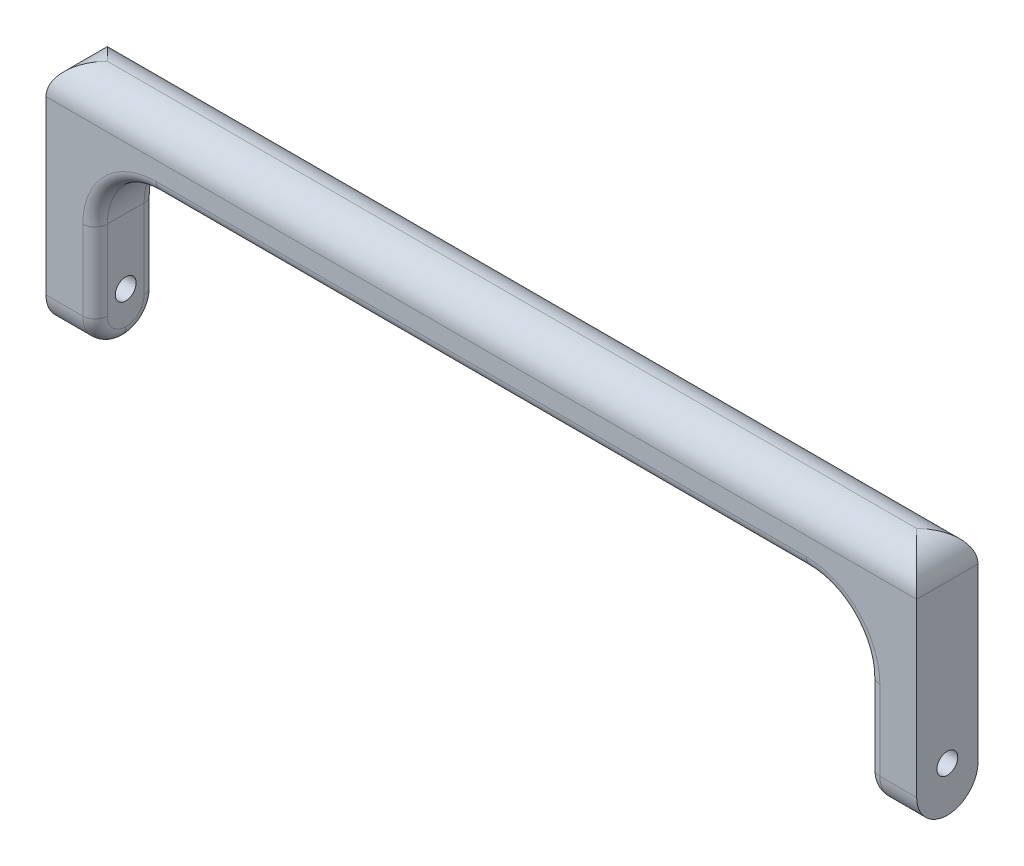
ISO-10303-21;
HEADER;
FILE_DESCRIPTION(('STEP AP214'),'2;1');
FILE_NAME('part.step','',(''),(''),'','','');
FILE_SCHEMA(('AUTOMOTIVE_DESIGN { 1 0 10303 214 1 1 1 1 }'));
ENDSEC;
DATA;
#1=APPLICATION_CONTEXT('core data for automotive mechanical design processes');
#2=APPLICATION_PROTOCOL_DEFINITION('international standard','automotive_design',2000,#1);
#3=PRODUCT_CONTEXT('',#1,'mechanical');
#4=PRODUCT('Part','Part','',(#3));
#5=PRODUCT_RELATED_PRODUCT_CATEGORY('part','',(#4));
#6=PRODUCT_DEFINITION_FORMATION('','',#4);
#7=PRODUCT_DEFINITION_CONTEXT('part definition',#1,'design');
#8=PRODUCT_DEFINITION('design','',#6,#7);
#9=PRODUCT_DEFINITION_SHAPE('','',#8);
#10=(LENGTH_UNIT() NAMED_UNIT(*) SI_UNIT(.MILLI.,.METRE.));
#11=(NAMED_UNIT(*) PLANE_ANGLE_UNIT() SI_UNIT($,.RADIAN.));
#12=(NAMED_UNIT(*) SI_UNIT($,.STERADIAN.) SOLID_ANGLE_UNIT());
#13=UNCERTAINTY_MEASURE_WITH_UNIT(LENGTH_MEASURE(1.E-05),#10,'distance_accuracy_value','');
#14=(GEOMETRIC_REPRESENTATION_CONTEXT(3) GLOBAL_UNCERTAINTY_ASSIGNED_CONTEXT((#13)) GLOBAL_UNIT_ASSIGNED_CONTEXT((#10,
#11,#12)) REPRESENTATION_CONTEXT('',''));
#15=CARTESIAN_POINT('',(0.,0.,0.));
#16=DIRECTION('',(0.,0.,1.));
#17=DIRECTION('',(1.,0.,0.));
#18=AXIS2_PLACEMENT_3D('',#15,#16,#17);
#19=CARTESIAN_POINT('',(-53.,-10.,5.));
#20=DIRECTION('',(0.,0.,-1.));
#21=DIRECTION('',(-1.,0.,0.));
#22=AXIS2_PLACEMENT_3D('',#19,#20,#21);
#23=CYLINDRICAL_SURFACE('',#22,10.);
#24=DIRECTION('',(0.,0.,-1.));
#25=VECTOR('',#24,1.);
#26=CARTESIAN_POINT('',(-63.,-10.,5.));
#27=LINE('',#26,#25);
#28=CARTESIAN_POINT('',(-63.,-10.,3.));
#29=VERTEX_POINT('',#28);
#30=CARTESIAN_POINT('',(-63.,-10.,-3.));
#31=VERTEX_POINT('',#30);
#32=EDGE_CURVE('E225',#29,#31,#27,.T.);
#33=ORIENTED_EDGE('',*,*,#32,.T.);
#34=CARTESIAN_POINT('',(-53.,-10.,-3.));
#35=DIRECTION('',(0.,0.,1.));
#36=DIRECTION('',(1.,0.,0.));
#37=AXIS2_PLACEMENT_3D('',#34,#35,#36);
#38=CIRCLE('',#37,10.);
#39=CARTESIAN_POINT('',(-53.,0.,-3.));
#40=VERTEX_POINT('',#39);
#41=EDGE_CURVE('E311',#31,#40,#38,.F.);
#42=ORIENTED_EDGE('',*,*,#41,.T.);
#43=DIRECTION('',(0.,0.,-1.));
#44=VECTOR('',#43,1.);
#45=CARTESIAN_POINT('',(-53.,0.,5.));
#46=LINE('',#45,#44);
#47=CARTESIAN_POINT('',(-53.,0.,3.));
#48=VERTEX_POINT('',#47);
#49=EDGE_CURVE('E237',#48,#40,#46,.T.);
#50=ORIENTED_EDGE('',*,*,#49,.F.);
#51=CARTESIAN_POINT('',(-53.,-10.,3.));
#52=DIRECTION('',(0.,0.,1.));
#53=DIRECTION('',(1.,0.,0.));
#54=AXIS2_PLACEMENT_3D('',#51,#52,#53);
#55=CIRCLE('',#54,10.);
#56=EDGE_CURVE('E308',#48,#29,#55,.T.);
#57=ORIENTED_EDGE('',*,*,#56,.T.);
#58=EDGE_LOOP('',(#33,#42,#50,#57));
#59=FACE_BOUND('',#58,.T.);
#60=ADVANCED_FACE('F43',(#59),#23,.F.);
#61=CARTESIAN_POINT('',(0.,0.,5.));
#62=DIRECTION('',(0.,1.,0.));
#63=DIRECTION('',(-1.,0.,0.));
#64=AXIS2_PLACEMENT_3D('',#61,#62,#63);
#65=PLANE('',#64);
#66=DIRECTION('',(0.,0.,-1.));
#67=VECTOR('',#66,1.);
#68=CARTESIAN_POINT('',(53.,0.,5.));
#69=LINE('',#68,#67);
#70=CARTESIAN_POINT('',(53.,0.,3.));
#71=VERTEX_POINT('',#70);
#72=CARTESIAN_POINT('',(53.,0.,-3.));
#73=VERTEX_POINT('',#72);
#74=EDGE_CURVE('E233',#71,#73,#69,.T.);
#75=ORIENTED_EDGE('',*,*,#74,.F.);
#76=DIRECTION('',(1.,0.,0.));
#77=VECTOR('',#76,1.);
#78=CARTESIAN_POINT('',(-53.,0.,3.));
#79=LINE('',#78,#77);
#80=EDGE_CURVE('E351',#71,#48,#79,.F.);
#81=ORIENTED_EDGE('',*,*,#80,.T.);
#82=ORIENTED_EDGE('',*,*,#49,.T.);
#83=DIRECTION('',(1.,0.,0.));
#84=VECTOR('',#83,1.);
#85=CARTESIAN_POINT('',(0.,0.,-3.));
#86=LINE('',#85,#84);
#87=EDGE_CURVE('E348',#40,#73,#86,.T.);
#88=ORIENTED_EDGE('',*,*,#87,.T.);
#89=EDGE_LOOP('',(#75,#81,#82,#88));
#90=FACE_BOUND('',#89,.T.);
#91=ADVANCED_FACE('F441',(#90),#65,.F.);
#92=CARTESIAN_POINT('',(53.,-10.,5.));
#93=DIRECTION('',(0.,0.,-1.));
#94=DIRECTION('',(-1.,0.,0.));
#95=AXIS2_PLACEMENT_3D('',#92,#93,#94);
#96=CYLINDRICAL_SURFACE('',#95,10.);
#97=DIRECTION('',(0.,0.,-1.));
#98=VECTOR('',#97,1.);
#99=CARTESIAN_POINT('',(63.,-10.,5.));
#100=LINE('',#99,#98);
#101=CARTESIAN_POINT('',(63.,-10.,3.));
#102=VERTEX_POINT('',#101);
#103=CARTESIAN_POINT('',(63.,-10.,-3.));
#104=VERTEX_POINT('',#103);
#105=EDGE_CURVE('E229',#102,#104,#100,.T.);
#106=ORIENTED_EDGE('',*,*,#105,.F.);
#107=CARTESIAN_POINT('',(53.,-10.,3.));
#108=DIRECTION('',(0.,0.,1.));
#109=DIRECTION('',(1.,0.,0.));
#110=AXIS2_PLACEMENT_3D('',#107,#108,#109);
#111=CIRCLE('',#110,10.);
#112=EDGE_CURVE('E357',#102,#71,#111,.T.);
#113=ORIENTED_EDGE('',*,*,#112,.T.);
#114=ORIENTED_EDGE('',*,*,#74,.T.);
#115=CARTESIAN_POINT('',(53.,-10.,-3.));
#116=DIRECTION('',(0.,0.,1.));
#117=DIRECTION('',(1.,0.,0.));
#118=AXIS2_PLACEMENT_3D('',#115,#116,#117);
#119=CIRCLE('',#118,10.);
#120=EDGE_CURVE('E354',#73,#104,#119,.F.);
#121=ORIENTED_EDGE('',*,*,#120,.T.);
#122=EDGE_LOOP('',(#106,#113,#114,#121));
#123=FACE_BOUND('',#122,.T.);
#124=ADVANCED_FACE('F438',(#123),#96,.F.);
#125=CARTESIAN_POINT('',(63.,0.,5.));
#126=DIRECTION('',(1.,0.,0.));
#127=DIRECTION('',(0.,0.,-1.));
#128=AXIS2_PLACEMENT_3D('',#125,#126,#127);
#129=PLANE('',#128);
#130=CARTESIAN_POINT('',(63.,-20.6526190027034,0.));
#131=DIRECTION('',(1.,0.,0.));
#132=DIRECTION('',(0.,0.,-1.));
#133=AXIS2_PLACEMENT_3D('',#130,#131,#132);
#134=CIRCLE('',#133,1.7);
#135=CARTESIAN_POINT('',(63.,-20.6526190027034,-1.7));
#136=VERTEX_POINT('',#135);
#137=EDGE_CURVE('E377',#136,#136,#134,.T.);
#138=ORIENTED_EDGE('',*,*,#137,.T.);
#139=EDGE_LOOP('',(#138));
#140=FACE_BOUND('',#139,.T.);
#141=CARTESIAN_POINT('',(63.,-23.,0.));
#142=DIRECTION('',(1.,0.,0.));
#143=DIRECTION('',(0.,0.,-1.));
#144=AXIS2_PLACEMENT_3D('',#141,#142,#143);
#145=CIRCLE('',#144,3.);
#146=CARTESIAN_POINT('',(63.,-26.,0.));
#147=VERTEX_POINT('',#146);
#148=CARTESIAN_POINT('',(63.,-23.,3.));
#149=VERTEX_POINT('',#148);
#150=EDGE_CURVE('E68',#147,#149,#145,.F.);
#151=ORIENTED_EDGE('',*,*,#150,.T.);
#152=DIRECTION('',(0.,-1.,0.));
#153=VECTOR('',#152,1.);
#154=CARTESIAN_POINT('',(63.,-10.,3.));
#155=LINE('',#154,#153);
#156=EDGE_CURVE('E368',#149,#102,#155,.F.);
#157=ORIENTED_EDGE('',*,*,#156,.T.);
#158=ORIENTED_EDGE('',*,*,#105,.T.);
#159=DIRECTION('',(0.,-1.,0.));
#160=VECTOR('',#159,1.);
#161=CARTESIAN_POINT('',(63.,0.,-3.));
#162=LINE('',#161,#160);
#163=CARTESIAN_POINT('',(63.,-23.,-3.));
#164=VERTEX_POINT('',#163);
#165=EDGE_CURVE('E360',#104,#164,#162,.T.);
#166=ORIENTED_EDGE('',*,*,#165,.T.);
#167=CARTESIAN_POINT('',(63.,-23.,0.));
#168=DIRECTION('',(1.,0.,0.));
#169=DIRECTION('',(0.,0.,-1.));
#170=AXIS2_PLACEMENT_3D('',#167,#168,#169);
#171=CIRCLE('',#170,3.);
#172=EDGE_CURVE('E363',#164,#147,#171,.F.);
#173=ORIENTED_EDGE('',*,*,#172,.T.);
#174=EDGE_LOOP('',(#151,#157,#158,#166,#173));
#175=FACE_BOUND('',#174,.T.);
#176=ADVANCED_FACE('F467',(#140,#175),#129,.F.);
#177=CARTESIAN_POINT('',(71.,0.,5.));
#178=DIRECTION('',(-1.,0.,0.));
#179=DIRECTION('',(0.,0.,1.));
#180=AXIS2_PLACEMENT_3D('',#177,#178,#179);
#181=PLANE('',#180);
#182=CARTESIAN_POINT('',(71.,-20.6526190027034,0.));
#183=DIRECTION('',(1.,0.,0.));
#184=DIRECTION('',(0.,0.,-1.));
#185=AXIS2_PLACEMENT_3D('',#182,#183,#184);
#186=CIRCLE('',#185,1.7);
#187=CARTESIAN_POINT('',(71.,-20.6526190027034,-1.7));
#188=VERTEX_POINT('',#187);
#189=EDGE_CURVE('E820',#188,#188,#186,.T.);
#190=ORIENTED_EDGE('',*,*,#189,.F.);
#191=EDGE_LOOP('',(#190));
#192=FACE_BOUND('',#191,.T.);
#193=DIRECTION('',(0.,1.,0.));
#194=VECTOR('',#193,1.);
#195=CARTESIAN_POINT('',(71.,0.,-5.));
#196=LINE('',#195,#194);
#197=CARTESIAN_POINT('',(71.,-23.,-5.));
#198=VERTEX_POINT('',#197);
#199=CARTESIAN_POINT('',(71.,5.00000000000001,-5.));
#200=VERTEX_POINT('',#199);
#201=EDGE_CURVE('E214',#198,#200,#196,.T.);
#202=ORIENTED_EDGE('',*,*,#201,.T.);
#203=DIRECTION('',(0.,0.,-1.));
#204=VECTOR('',#203,1.);
#205=CARTESIAN_POINT('',(71.,5.00000000000001,5.));
#206=LINE('',#205,#204);
#207=CARTESIAN_POINT('',(71.,5.00000000000001,5.));
#208=VERTEX_POINT('',#207);
#209=EDGE_CURVE('E271',#200,#208,#206,.F.);
#210=ORIENTED_EDGE('',*,*,#209,.T.);
#211=DIRECTION('',(0.,1.,0.));
#212=VECTOR('',#211,1.);
#213=CARTESIAN_POINT('',(71.,0.,5.));
#214=LINE('',#213,#212);
#215=CARTESIAN_POINT('',(71.,-23.,5.));
#216=VERTEX_POINT('',#215);
#217=EDGE_CURVE('E213',#216,#208,#214,.T.);
#218=ORIENTED_EDGE('',*,*,#217,.F.);
#219=CARTESIAN_POINT('',(71.,-23.,0.));
#220=DIRECTION('',(-1.,0.,0.));
#221=DIRECTION('',(0.,0.,1.));
#222=AXIS2_PLACEMENT_3D('',#219,#220,#221);
#223=CIRCLE('',#222,5.);
#224=CARTESIAN_POINT('',(71.,-28.,0.));
#225=VERTEX_POINT('',#224);
#226=EDGE_CURVE('E252',#216,#225,#223,.F.);
#227=ORIENTED_EDGE('',*,*,#226,.T.);
#228=CARTESIAN_POINT('',(71.,-23.,0.));
#229=DIRECTION('',(-1.,0.,0.));
#230=DIRECTION('',(0.,0.,1.));
#231=AXIS2_PLACEMENT_3D('',#228,#229,#230);
#232=CIRCLE('',#231,5.);
#233=EDGE_CURVE('E255',#225,#198,#232,.F.);
#234=ORIENTED_EDGE('',*,*,#233,.T.);
#235=EDGE_LOOP('',(#202,#210,#218,#227,#234));
#236=FACE_BOUND('',#235,.T.);
#237=ADVANCED_FACE('F745',(#192,#236),#181,.F.);
#238=CARTESIAN_POINT('',(-71.,0.,5.));
#239=DIRECTION('',(-1.,0.,0.));
#240=DIRECTION('',(0.,0.,1.));
#241=AXIS2_PLACEMENT_3D('',#238,#239,#240);
#242=PLANE('',#241);
#243=CARTESIAN_POINT('',(-71.,-20.6526190027034,0.));
#244=DIRECTION('',(-1.,0.,0.));
#245=DIRECTION('',(0.,0.,1.));
#246=AXIS2_PLACEMENT_3D('',#243,#244,#245);
#247=CIRCLE('',#246,1.7);
#248=CARTESIAN_POINT('',(-71.,-20.6526190027034,1.7));
#249=VERTEX_POINT('',#248);
#250=EDGE_CURVE('E816',#249,#249,#247,.T.);
#251=ORIENTED_EDGE('',*,*,#250,.F.);
#252=EDGE_LOOP('',(#251));
#253=FACE_BOUND('',#252,.T.);
#254=DIRECTION('',(0.,1.,0.));
#255=VECTOR('',#254,1.);
#256=CARTESIAN_POINT('',(-71.,0.,5.));
#257=LINE('',#256,#255);
#258=CARTESIAN_POINT('',(-71.,-23.,5.));
#259=VERTEX_POINT('',#258);
#260=CARTESIAN_POINT('',(-71.,4.99999999999999,5.));
#261=VERTEX_POINT('',#260);
#262=EDGE_CURVE('E219',#259,#261,#257,.T.);
#263=ORIENTED_EDGE('',*,*,#262,.T.);
#264=DIRECTION('',(0.,0.,-1.));
#265=VECTOR('',#264,1.);
#266=CARTESIAN_POINT('',(-71.,4.99999999999999,-5.));
#267=LINE('',#266,#265);
#268=CARTESIAN_POINT('',(-71.,4.99999999999999,-5.));
#269=VERTEX_POINT('',#268);
#270=EDGE_CURVE('E211',#261,#269,#267,.T.);
#271=ORIENTED_EDGE('',*,*,#270,.T.);
#272=DIRECTION('',(0.,1.,0.));
#273=VECTOR('',#272,1.);
#274=CARTESIAN_POINT('',(-71.,0.,-5.));
#275=LINE('',#274,#273);
#276=CARTESIAN_POINT('',(-71.,-23.,-5.));
#277=VERTEX_POINT('',#276);
#278=EDGE_CURVE('E188',#277,#269,#275,.T.);
#279=ORIENTED_EDGE('',*,*,#278,.F.);
#280=CARTESIAN_POINT('',(-71.,-23.,0.));
#281=DIRECTION('',(-1.,0.,0.));
#282=DIRECTION('',(0.,0.,1.));
#283=AXIS2_PLACEMENT_3D('',#280,#281,#282);
#284=CIRCLE('',#283,5.);
#285=CARTESIAN_POINT('',(-71.,-28.,0.));
#286=VERTEX_POINT('',#285);
#287=EDGE_CURVE('E199',#277,#286,#284,.T.);
#288=ORIENTED_EDGE('',*,*,#287,.T.);
#289=CARTESIAN_POINT('',(-71.,-23.,0.));
#290=DIRECTION('',(-1.,0.,0.));
#291=DIRECTION('',(0.,0.,1.));
#292=AXIS2_PLACEMENT_3D('',#289,#290,#291);
#293=CIRCLE('',#292,5.);
#294=EDGE_CURVE('E195',#286,#259,#293,.T.);
#295=ORIENTED_EDGE('',*,*,#294,.T.);
#296=EDGE_LOOP('',(#263,#271,#279,#288,#295));
#297=FACE_BOUND('',#296,.T.);
#298=ADVANCED_FACE('F209',(#253,#297),#242,.T.);
#299=CARTESIAN_POINT('',(-63.,0.,5.));
#300=DIRECTION('',(1.,0.,0.));
#301=DIRECTION('',(0.,0.,-1.));
#302=AXIS2_PLACEMENT_3D('',#299,#300,#301);
#303=PLANE('',#302);
#304=CARTESIAN_POINT('',(-63.,-20.6526190027034,0.));
#305=DIRECTION('',(1.,0.,0.));
#306=DIRECTION('',(0.,0.,-1.));
#307=AXIS2_PLACEMENT_3D('',#304,#305,#306);
#308=CIRCLE('',#307,1.7);
#309=CARTESIAN_POINT('',(-63.,-20.6526190027034,-1.7));
#310=VERTEX_POINT('',#309);
#311=EDGE_CURVE('E47',#310,#310,#308,.T.);
#312=ORIENTED_EDGE('',*,*,#311,.F.);
#313=EDGE_LOOP('',(#312));
#314=FACE_BOUND('',#313,.T.);
#315=CARTESIAN_POINT('',(-63.,-23.,0.));
#316=DIRECTION('',(1.,0.,0.));
#317=DIRECTION('',(0.,0.,-1.));
#318=AXIS2_PLACEMENT_3D('',#315,#316,#317);
#319=CIRCLE('',#318,3.);
#320=CARTESIAN_POINT('',(-63.,-26.,0.));
#321=VERTEX_POINT('',#320);
#322=CARTESIAN_POINT('',(-63.,-23.,-3.));
#323=VERTEX_POINT('',#322);
#324=EDGE_CURVE('E321',#321,#323,#319,.T.);
#325=ORIENTED_EDGE('',*,*,#324,.T.);
#326=DIRECTION('',(0.,-1.,0.));
#327=VECTOR('',#326,1.);
#328=CARTESIAN_POINT('',(-63.,-10.,-3.));
#329=LINE('',#328,#327);
#330=EDGE_CURVE('E324',#323,#31,#329,.F.);
#331=ORIENTED_EDGE('',*,*,#330,.T.);
#332=ORIENTED_EDGE('',*,*,#32,.F.);
#333=DIRECTION('',(0.,-1.,0.));
#334=VECTOR('',#333,1.);
#335=CARTESIAN_POINT('',(-63.,0.,3.));
#336=LINE('',#335,#334);
#337=CARTESIAN_POINT('',(-63.,-23.,3.));
#338=VERTEX_POINT('',#337);
#339=EDGE_CURVE('E315',#29,#338,#336,.T.);
#340=ORIENTED_EDGE('',*,*,#339,.T.);
#341=CARTESIAN_POINT('',(-63.,-23.,0.));
#342=DIRECTION('',(1.,0.,0.));
#343=DIRECTION('',(0.,0.,-1.));
#344=AXIS2_PLACEMENT_3D('',#341,#342,#343);
#345=CIRCLE('',#344,3.);
#346=EDGE_CURVE('E318',#338,#321,#345,.T.);
#347=ORIENTED_EDGE('',*,*,#346,.T.);
#348=EDGE_LOOP('',(#325,#331,#332,#340,#347));
#349=FACE_BOUND('',#348,.T.);
#350=ADVANCED_FACE('F717',(#314,#349),#303,.T.);
#351=CARTESIAN_POINT('',(0.,0.,5.));
#352=DIRECTION('',(0.,0.,1.));
#353=DIRECTION('',(1.,0.,0.));
#354=AXIS2_PLACEMENT_3D('',#351,#352,#353);
#355=PLANE('',#354);
#356=DIRECTION('',(-1.,0.,0.));
#357=VECTOR('',#356,1.);
#358=CARTESIAN_POINT('',(0.,-23.,5.));
#359=LINE('',#358,#357);
#360=CARTESIAN_POINT('',(-65.,-23.,5.));
#361=VERTEX_POINT('',#360);
#362=EDGE_CURVE('E248',#259,#361,#359,.F.);
#363=ORIENTED_EDGE('',*,*,#362,.T.);
#364=DIRECTION('',(0.,-1.,0.));
#365=VECTOR('',#364,1.);
#366=CARTESIAN_POINT('',(-65.,0.,5.));
#367=LINE('',#366,#365);
#368=CARTESIAN_POINT('',(-65.,-10.,5.));
#369=VERTEX_POINT('',#368);
#370=EDGE_CURVE('E345',#361,#369,#367,.F.);
#371=ORIENTED_EDGE('',*,*,#370,.T.);
#372=CARTESIAN_POINT('',(-53.,-10.,5.));
#373=DIRECTION('',(0.,0.,1.));
#374=DIRECTION('',(1.,0.,0.));
#375=AXIS2_PLACEMENT_3D('',#372,#373,#374);
#376=CIRCLE('',#375,12.);
#377=CARTESIAN_POINT('',(-53.,1.99999999999999,5.));
#378=VERTEX_POINT('',#377);
#379=EDGE_CURVE('E342',#369,#378,#376,.F.);
#380=ORIENTED_EDGE('',*,*,#379,.T.);
#381=DIRECTION('',(1.,0.,0.));
#382=VECTOR('',#381,1.);
#383=CARTESIAN_POINT('',(53.,2.00000000000001,5.));
#384=LINE('',#383,#382);
#385=CARTESIAN_POINT('',(53.,2.00000000000001,5.));
#386=VERTEX_POINT('',#385);
#387=EDGE_CURVE('E339',#378,#386,#384,.T.);
#388=ORIENTED_EDGE('',*,*,#387,.T.);
#389=CARTESIAN_POINT('',(53.,-10.,5.));
#390=DIRECTION('',(0.,0.,1.));
#391=DIRECTION('',(1.,0.,0.));
#392=AXIS2_PLACEMENT_3D('',#389,#390,#391);
#393=CIRCLE('',#392,12.);
#394=CARTESIAN_POINT('',(65.,-10.,5.));
#395=VERTEX_POINT('',#394);
#396=EDGE_CURVE('E336',#386,#395,#393,.F.);
#397=ORIENTED_EDGE('',*,*,#396,.T.);
#398=DIRECTION('',(0.,-1.,0.));
#399=VECTOR('',#398,1.);
#400=CARTESIAN_POINT('',(65.,-23.,5.));
#401=LINE('',#400,#399);
#402=CARTESIAN_POINT('',(65.,-23.,5.));
#403=VERTEX_POINT('',#402);
#404=EDGE_CURVE('E333',#395,#403,#401,.T.);
#405=ORIENTED_EDGE('',*,*,#404,.T.);
#406=DIRECTION('',(1.,0.,0.));
#407=VECTOR('',#406,1.);
#408=CARTESIAN_POINT('',(71.,-23.,5.));
#409=LINE('',#408,#407);
#410=EDGE_CURVE('E206',#403,#216,#409,.T.);
#411=ORIENTED_EDGE('',*,*,#410,.T.);
#412=ORIENTED_EDGE('',*,*,#217,.T.);
#413=DIRECTION('',(-1.,0.,0.));
#414=VECTOR('',#413,1.);
#415=CARTESIAN_POINT('',(-71.,4.99999999999999,5.));
#416=LINE('',#415,#414);
#417=EDGE_CURVE('E258',#208,#261,#416,.T.);
#418=ORIENTED_EDGE('',*,*,#417,.T.);
#419=ORIENTED_EDGE('',*,*,#262,.F.);
#420=EDGE_LOOP('',(#363,#371,#380,#388,#397,#405,#411,#412,#418,#419));
#421=FACE_BOUND('',#420,.T.);
#422=ADVANCED_FACE('F706',(#421),#355,.T.);
#423=CARTESIAN_POINT('',(0.,0.,-5.));
#424=DIRECTION('',(0.,0.,1.));
#425=DIRECTION('',(1.,0.,0.));
#426=AXIS2_PLACEMENT_3D('',#423,#424,#425);
#427=PLANE('',#426);
#428=CARTESIAN_POINT('',(-53.,-10.,-5.));
#429=DIRECTION('',(0.,0.,1.));
#430=DIRECTION('',(1.,0.,0.));
#431=AXIS2_PLACEMENT_3D('',#428,#429,#430);
#432=CIRCLE('',#431,12.);
#433=CARTESIAN_POINT('',(-53.,1.99999999999999,-5.));
#434=VERTEX_POINT('',#433);
#435=CARTESIAN_POINT('',(-65.,-10.,-5.));
#436=VERTEX_POINT('',#435);
#437=EDGE_CURVE('E303',#434,#436,#432,.T.);
#438=ORIENTED_EDGE('',*,*,#437,.T.);
#439=DIRECTION('',(0.,-1.,0.));
#440=VECTOR('',#439,1.);
#441=CARTESIAN_POINT('',(-65.,-23.,-5.));
#442=LINE('',#441,#440);
#443=CARTESIAN_POINT('',(-65.,-23.,-5.));
#444=VERTEX_POINT('',#443);
#445=EDGE_CURVE('E191',#436,#444,#442,.T.);
#446=ORIENTED_EDGE('',*,*,#445,.T.);
#447=DIRECTION('',(-1.,0.,0.));
#448=VECTOR('',#447,1.);
#449=CARTESIAN_POINT('',(-71.,-23.,-5.));
#450=LINE('',#449,#448);
#451=EDGE_CURVE('E183',#444,#277,#450,.T.);
#452=ORIENTED_EDGE('',*,*,#451,.T.);
#453=ORIENTED_EDGE('',*,*,#278,.T.);
#454=DIRECTION('',(-1.,0.,0.));
#455=VECTOR('',#454,1.);
#456=CARTESIAN_POINT('',(0.,5.,-5.));
#457=LINE('',#456,#455);
#458=EDGE_CURVE('E268',#269,#200,#457,.F.);
#459=ORIENTED_EDGE('',*,*,#458,.T.);
#460=ORIENTED_EDGE('',*,*,#201,.F.);
#461=DIRECTION('',(1.,0.,0.));
#462=VECTOR('',#461,1.);
#463=CARTESIAN_POINT('',(0.,-23.,-5.));
#464=LINE('',#463,#462);
#465=CARTESIAN_POINT('',(65.,-23.,-5.));
#466=VERTEX_POINT('',#465);
#467=EDGE_CURVE('E196',#198,#466,#464,.F.);
#468=ORIENTED_EDGE('',*,*,#467,.T.);
#469=DIRECTION('',(0.,-1.,0.));
#470=VECTOR('',#469,1.);
#471=CARTESIAN_POINT('',(65.,0.,-5.));
#472=LINE('',#471,#470);
#473=CARTESIAN_POINT('',(65.,-10.,-5.));
#474=VERTEX_POINT('',#473);
#475=EDGE_CURVE('E300',#466,#474,#472,.F.);
#476=ORIENTED_EDGE('',*,*,#475,.T.);
#477=CARTESIAN_POINT('',(53.,-10.,-5.));
#478=DIRECTION('',(0.,0.,1.));
#479=DIRECTION('',(1.,0.,0.));
#480=AXIS2_PLACEMENT_3D('',#477,#478,#479);
#481=CIRCLE('',#480,12.);
#482=CARTESIAN_POINT('',(53.,2.00000000000001,-5.));
#483=VERTEX_POINT('',#482);
#484=EDGE_CURVE('E297',#474,#483,#481,.T.);
#485=ORIENTED_EDGE('',*,*,#484,.T.);
#486=DIRECTION('',(1.,0.,0.));
#487=VECTOR('',#486,1.);
#488=CARTESIAN_POINT('',(0.,2.,-5.));
#489=LINE('',#488,#487);
#490=EDGE_CURVE('E276',#483,#434,#489,.F.);
#491=ORIENTED_EDGE('',*,*,#490,.T.);
#492=EDGE_LOOP('',(#438,#446,#452,#453,#459,#460,#468,#476,#485,#491));
#493=FACE_BOUND('',#492,.T.);
#494=ADVANCED_FACE('F186',(#493),#427,.F.);
#495=CARTESIAN_POINT('',(0.,-23.,0.));
#496=DIRECTION('',(-1.,0.,0.));
#497=DIRECTION('',(0.,-1.,0.));
#498=AXIS2_PLACEMENT_3D('',#495,#496,#497);
#499=CYLINDRICAL_SURFACE('',#498,5.);
#500=DIRECTION('',(-1.,0.,0.));
#501=VECTOR('',#500,1.);
#502=CARTESIAN_POINT('',(0.,-28.,0.));
#503=LINE('',#502,#501);
#504=CARTESIAN_POINT('',(-65.,-28.,0.));
#505=VERTEX_POINT('',#504);
#506=EDGE_CURVE('E202',#505,#286,#503,.T.);
#507=ORIENTED_EDGE('',*,*,#506,.F.);
#508=CARTESIAN_POINT('',(-65.,-23.,0.));
#509=DIRECTION('',(1.,0.,0.));
#510=DIRECTION('',(0.,0.,-1.));
#511=AXIS2_PLACEMENT_3D('',#508,#509,#510);
#512=CIRCLE('',#511,5.);
#513=EDGE_CURVE('E330',#505,#361,#512,.F.);
#514=ORIENTED_EDGE('',*,*,#513,.T.);
#515=ORIENTED_EDGE('',*,*,#362,.F.);
#516=ORIENTED_EDGE('',*,*,#294,.F.);
#517=EDGE_LOOP('',(#507,#514,#515,#516));
#518=FACE_BOUND('',#517,.T.);
#519=ADVANCED_FACE('F501',(#518),#499,.T.);
#520=CARTESIAN_POINT('',(0.,-23.,0.));
#521=DIRECTION('',(1.,0.,0.));
#522=DIRECTION('',(0.,1.,0.));
#523=AXIS2_PLACEMENT_3D('',#520,#521,#522);
#524=CYLINDRICAL_SURFACE('',#523,5.);
#525=ORIENTED_EDGE('',*,*,#451,.F.);
#526=CARTESIAN_POINT('',(-65.,-23.,0.));
#527=DIRECTION('',(1.,0.,0.));
#528=DIRECTION('',(0.,0.,-1.));
#529=AXIS2_PLACEMENT_3D('',#526,#527,#528);
#530=CIRCLE('',#529,5.);
#531=EDGE_CURVE('E327',#444,#505,#530,.F.);
#532=ORIENTED_EDGE('',*,*,#531,.T.);
#533=ORIENTED_EDGE('',*,*,#506,.T.);
#534=ORIENTED_EDGE('',*,*,#287,.F.);
#535=EDGE_LOOP('',(#525,#532,#533,#534));
#536=FACE_BOUND('',#535,.T.);
#537=ADVANCED_FACE('F200',(#536),#524,.T.);
#538=CARTESIAN_POINT('',(0.,-23.,0.));
#539=DIRECTION('',(-1.,0.,0.));
#540=DIRECTION('',(0.,0.,1.));
#541=AXIS2_PLACEMENT_3D('',#538,#539,#540);
#542=CYLINDRICAL_SURFACE('',#541,5.);
#543=ORIENTED_EDGE('',*,*,#410,.F.);
#544=CARTESIAN_POINT('',(65.,-23.,0.));
#545=DIRECTION('',(1.,0.,0.));
#546=DIRECTION('',(0.,0.,-1.));
#547=AXIS2_PLACEMENT_3D('',#544,#545,#546);
#548=CIRCLE('',#547,5.);
#549=CARTESIAN_POINT('',(65.,-28.,0.));
#550=VERTEX_POINT('',#549);
#551=EDGE_CURVE('E53',#403,#550,#548,.T.);
#552=ORIENTED_EDGE('',*,*,#551,.T.);
#553=DIRECTION('',(1.,0.,0.));
#554=VECTOR('',#553,1.);
#555=CARTESIAN_POINT('',(63.,-28.,0.));
#556=LINE('',#555,#554);
#557=EDGE_CURVE('E261',#225,#550,#556,.F.);
#558=ORIENTED_EDGE('',*,*,#557,.F.);
#559=ORIENTED_EDGE('',*,*,#226,.F.);
#560=EDGE_LOOP('',(#543,#552,#558,#559));
#561=FACE_BOUND('',#560,.T.);
#562=ADVANCED_FACE('F500',(#561),#542,.T.);
#563=CARTESIAN_POINT('',(0.,-23.,0.));
#564=DIRECTION('',(1.,0.,0.));
#565=DIRECTION('',(0.,0.,-1.));
#566=AXIS2_PLACEMENT_3D('',#563,#564,#565);
#567=CYLINDRICAL_SURFACE('',#566,5.);
#568=ORIENTED_EDGE('',*,*,#557,.T.);
#569=CARTESIAN_POINT('',(65.,-23.,0.));
#570=DIRECTION('',(1.,0.,0.));
#571=DIRECTION('',(0.,0.,-1.));
#572=AXIS2_PLACEMENT_3D('',#569,#570,#571);
#573=CIRCLE('',#572,5.);
#574=EDGE_CURVE('E11',#550,#466,#573,.T.);
#575=ORIENTED_EDGE('',*,*,#574,.T.);
#576=ORIENTED_EDGE('',*,*,#467,.F.);
#577=ORIENTED_EDGE('',*,*,#233,.F.);
#578=EDGE_LOOP('',(#568,#575,#576,#577));
#579=FACE_BOUND('',#578,.T.);
#580=ADVANCED_FACE('F505',(#579),#567,.T.);
#581=CARTESIAN_POINT('',(0.,5.,0.));
#582=DIRECTION('',(-1.,0.,0.));
#583=DIRECTION('',(0.,-1.,0.));
#584=AXIS2_PLACEMENT_3D('',#581,#582,#583);
#585=CYLINDRICAL_SURFACE('',#584,5.);
#586=CARTESIAN_POINT('',(66.,5.00000000000001,0.));
#587=DIRECTION('',(-0.707106781186547,0.,-0.707106781186547));
#588=DIRECTION('',(0.707106781186547,0.,-0.707106781186547));
#589=AXIS2_PLACEMENT_3D('',#586,#587,#588);
#590=ELLIPSE('',#589,7.07106781186547,5.);
#591=CARTESIAN_POINT('',(66.,10.,0.));
#592=VERTEX_POINT('',#591);
#593=EDGE_CURVE('E264',#200,#592,#590,.F.);
#594=ORIENTED_EDGE('',*,*,#593,.F.);
#595=ORIENTED_EDGE('',*,*,#458,.F.);
#596=CARTESIAN_POINT('',(-66.,4.99999999999999,0.));
#597=DIRECTION('',(-0.707106781186547,0.,0.707106781186547));
#598=DIRECTION('',(0.707106781186547,0.,0.707106781186547));
#599=AXIS2_PLACEMENT_3D('',#596,#597,#598);
#600=ELLIPSE('',#599,7.07106781186547,5.);
#601=CARTESIAN_POINT('',(-66.,9.99999999999999,0.));
#602=VERTEX_POINT('',#601);
#603=EDGE_CURVE('E289',#602,#269,#600,.T.);
#604=ORIENTED_EDGE('',*,*,#603,.F.);
#605=DIRECTION('',(-1.,0.,0.));
#606=VECTOR('',#605,1.);
#607=CARTESIAN_POINT('',(0.,10.,0.));
#608=LINE('',#607,#606);
#609=EDGE_CURVE('E285',#592,#602,#608,.T.);
#610=ORIENTED_EDGE('',*,*,#609,.F.);
#611=EDGE_LOOP('',(#594,#595,#604,#610));
#612=FACE_BOUND('',#611,.T.);
#613=ADVANCED_FACE('F508',(#612),#585,.T.);
#614=CARTESIAN_POINT('',(66.,5.00000000000001,5.));
#615=DIRECTION('',(0.,0.,-1.));
#616=DIRECTION('',(-1.,0.,0.));
#617=AXIS2_PLACEMENT_3D('',#614,#615,#616);
#618=CYLINDRICAL_SURFACE('',#617,5.);
#619=ORIENTED_EDGE('',*,*,#209,.F.);
#620=ORIENTED_EDGE('',*,*,#593,.T.);
#621=CARTESIAN_POINT('',(66.,5.00000000000001,0.));
#622=DIRECTION('',(0.707106781186547,0.,-0.707106781186547));
#623=DIRECTION('',(-0.707106781186547,0.,-0.707106781186547));
#624=AXIS2_PLACEMENT_3D('',#621,#622,#623);
#625=ELLIPSE('',#624,7.07106781186547,5.);
#626=EDGE_CURVE('E280',#208,#592,#625,.F.);
#627=ORIENTED_EDGE('',*,*,#626,.F.);
#628=EDGE_LOOP('',(#619,#620,#627));
#629=FACE_BOUND('',#628,.T.);
#630=ADVANCED_FACE('F519',(#629),#618,.T.);
#631=CARTESIAN_POINT('',(-66.,4.99999999999999,5.));
#632=DIRECTION('',(0.,0.,1.));
#633=DIRECTION('',(1.,0.,0.));
#634=AXIS2_PLACEMENT_3D('',#631,#632,#633);
#635=CYLINDRICAL_SURFACE('',#634,5.);
#636=ORIENTED_EDGE('',*,*,#603,.T.);
#637=ORIENTED_EDGE('',*,*,#270,.F.);
#638=CARTESIAN_POINT('',(-66.,4.99999999999999,0.));
#639=DIRECTION('',(0.707106781186547,0.,0.707106781186547));
#640=DIRECTION('',(-0.707106781186547,0.,0.707106781186547));
#641=AXIS2_PLACEMENT_3D('',#638,#639,#640);
#642=ELLIPSE('',#641,7.07106781186547,5.);
#643=EDGE_CURVE('E277',#602,#261,#642,.T.);
#644=ORIENTED_EDGE('',*,*,#643,.F.);
#645=EDGE_LOOP('',(#636,#637,#644));
#646=FACE_BOUND('',#645,.T.);
#647=ADVANCED_FACE('F515',(#646),#635,.T.);
#648=CARTESIAN_POINT('',(0.,5.,0.));
#649=DIRECTION('',(1.,0.,0.));
#650=DIRECTION('',(0.,1.,0.));
#651=AXIS2_PLACEMENT_3D('',#648,#649,#650);
#652=CYLINDRICAL_SURFACE('',#651,5.);
#653=ORIENTED_EDGE('',*,*,#626,.T.);
#654=ORIENTED_EDGE('',*,*,#609,.T.);
#655=ORIENTED_EDGE('',*,*,#643,.T.);
#656=ORIENTED_EDGE('',*,*,#417,.F.);
#657=EDGE_LOOP('',(#653,#654,#655,#656));
#658=FACE_BOUND('',#657,.T.);
#659=ADVANCED_FACE('F512',(#658),#652,.T.);
#660=CARTESIAN_POINT('',(53.,-10.,3.));
#661=DIRECTION('',(0.,0.,1.));
#662=DIRECTION('',(1.,0.,0.));
#663=AXIS2_PLACEMENT_3D('',#660,#661,#662);
#664=TOROIDAL_SURFACE('',#663,12.,2.);
#665=CARTESIAN_POINT('',(53.,2.00000000000001,3.));
#666=DIRECTION('',(-1.,0.,0.));
#667=DIRECTION('',(0.,0.,1.));
#668=AXIS2_PLACEMENT_3D('',#665,#666,#667);
#669=CIRCLE('',#668,2.);
#670=EDGE_CURVE('E420',#71,#386,#669,.T.);
#671=ORIENTED_EDGE('',*,*,#670,.F.);
#672=ORIENTED_EDGE('',*,*,#112,.F.);
#673=CARTESIAN_POINT('',(65.,-10.,3.));
#674=DIRECTION('',(0.,-1.,0.));
#675=DIRECTION('',(0.,0.,-1.));
#676=AXIS2_PLACEMENT_3D('',#673,#674,#675);
#677=CIRCLE('',#676,2.);
#678=EDGE_CURVE('E281',#395,#102,#677,.T.);
#679=ORIENTED_EDGE('',*,*,#678,.F.);
#680=ORIENTED_EDGE('',*,*,#396,.F.);
#681=EDGE_LOOP('',(#671,#672,#679,#680));
#682=FACE_BOUND('',#681,.T.);
#683=ADVANCED_FACE('F45',(#682),#664,.T.);
#684=CARTESIAN_POINT('',(65.,0.,3.));
#685=DIRECTION('',(0.,1.,0.));
#686=DIRECTION('',(0.,0.,1.));
#687=AXIS2_PLACEMENT_3D('',#684,#685,#686);
#688=CYLINDRICAL_SURFACE('',#687,2.);
#689=ORIENTED_EDGE('',*,*,#678,.T.);
#690=ORIENTED_EDGE('',*,*,#156,.F.);
#691=CARTESIAN_POINT('',(65.,-23.,3.));
#692=DIRECTION('',(0.,-1.,0.));
#693=DIRECTION('',(0.,0.,-1.));
#694=AXIS2_PLACEMENT_3D('',#691,#692,#693);
#695=CIRCLE('',#694,2.);
#696=EDGE_CURVE('E416',#403,#149,#695,.T.);
#697=ORIENTED_EDGE('',*,*,#696,.F.);
#698=ORIENTED_EDGE('',*,*,#404,.F.);
#699=EDGE_LOOP('',(#689,#690,#697,#698));
#700=FACE_BOUND('',#699,.T.);
#701=ADVANCED_FACE('F428',(#700),#688,.T.);
#702=CARTESIAN_POINT('',(0.,2.,3.));
#703=DIRECTION('',(-1.,0.,0.));
#704=DIRECTION('',(0.,-1.,0.));
#705=AXIS2_PLACEMENT_3D('',#702,#703,#704);
#706=CYLINDRICAL_SURFACE('',#705,2.);
#707=ORIENTED_EDGE('',*,*,#670,.T.);
#708=ORIENTED_EDGE('',*,*,#387,.F.);
#709=CARTESIAN_POINT('',(-53.,1.99999999999999,3.));
#710=DIRECTION('',(-1.,0.,0.));
#711=DIRECTION('',(0.,0.,1.));
#712=AXIS2_PLACEMENT_3D('',#709,#710,#711);
#713=CIRCLE('',#712,2.);
#714=EDGE_CURVE('E412',#48,#378,#713,.T.);
#715=ORIENTED_EDGE('',*,*,#714,.F.);
#716=ORIENTED_EDGE('',*,*,#80,.F.);
#717=EDGE_LOOP('',(#707,#708,#715,#716));
#718=FACE_BOUND('',#717,.T.);
#719=ADVANCED_FACE('F480',(#718),#706,.T.);
#720=CARTESIAN_POINT('',(65.,-23.,0.));
#721=DIRECTION('',(1.,0.,0.));
#722=DIRECTION('',(0.,0.,-1.));
#723=AXIS2_PLACEMENT_3D('',#720,#721,#722);
#724=TOROIDAL_SURFACE('',#723,3.,2.);
#725=ORIENTED_EDGE('',*,*,#696,.T.);
#726=ORIENTED_EDGE('',*,*,#150,.F.);
#727=CARTESIAN_POINT('',(65.,-26.,0.));
#728=DIRECTION('',(0.,0.,-1.));
#729=DIRECTION('',(-1.,0.,0.));
#730=AXIS2_PLACEMENT_3D('',#727,#728,#729);
#731=CIRCLE('',#730,2.);
#732=EDGE_CURVE('E408',#550,#147,#731,.T.);
#733=ORIENTED_EDGE('',*,*,#732,.F.);
#734=ORIENTED_EDGE('',*,*,#551,.F.);
#735=EDGE_LOOP('',(#725,#726,#733,#734));
#736=FACE_BOUND('',#735,.T.);
#737=ADVANCED_FACE('F477',(#736),#724,.T.);
#738=CARTESIAN_POINT('',(-53.,-10.,3.));
#739=DIRECTION('',(0.,0.,1.));
#740=DIRECTION('',(1.,0.,0.));
#741=AXIS2_PLACEMENT_3D('',#738,#739,#740);
#742=TOROIDAL_SURFACE('',#741,12.,2.);
#743=ORIENTED_EDGE('',*,*,#714,.T.);
#744=ORIENTED_EDGE('',*,*,#379,.F.);
#745=CARTESIAN_POINT('',(-65.,-10.,3.));
#746=DIRECTION('',(0.,-1.,0.));
#747=DIRECTION('',(0.,0.,-1.));
#748=AXIS2_PLACEMENT_3D('',#745,#746,#747);
#749=CIRCLE('',#748,2.);
#750=EDGE_CURVE('E404',#29,#369,#749,.T.);
#751=ORIENTED_EDGE('',*,*,#750,.F.);
#752=ORIENTED_EDGE('',*,*,#56,.F.);
#753=EDGE_LOOP('',(#743,#744,#751,#752));
#754=FACE_BOUND('',#753,.T.);
#755=ADVANCED_FACE('F479',(#754),#742,.T.);
#756=CARTESIAN_POINT('',(65.,-23.,0.));
#757=DIRECTION('',(1.,0.,0.));
#758=DIRECTION('',(0.,0.,-1.));
#759=AXIS2_PLACEMENT_3D('',#756,#757,#758);
#760=TOROIDAL_SURFACE('',#759,3.,2.);
#761=ORIENTED_EDGE('',*,*,#732,.T.);
#762=ORIENTED_EDGE('',*,*,#172,.F.);
#763=CARTESIAN_POINT('',(65.,-23.,-3.));
#764=DIRECTION('',(0.,1.,0.));
#765=DIRECTION('',(0.,0.,1.));
#766=AXIS2_PLACEMENT_3D('',#763,#764,#765);
#767=CIRCLE('',#766,2.);
#768=EDGE_CURVE('E400',#466,#164,#767,.T.);
#769=ORIENTED_EDGE('',*,*,#768,.F.);
#770=ORIENTED_EDGE('',*,*,#574,.F.);
#771=EDGE_LOOP('',(#761,#762,#769,#770));
#772=FACE_BOUND('',#771,.T.);
#773=ADVANCED_FACE('F474',(#772),#760,.T.);
#774=CARTESIAN_POINT('',(-65.,0.,3.));
#775=DIRECTION('',(0.,-1.,0.));
#776=DIRECTION('',(0.,0.,-1.));
#777=AXIS2_PLACEMENT_3D('',#774,#775,#776);
#778=CYLINDRICAL_SURFACE('',#777,2.);
#779=ORIENTED_EDGE('',*,*,#750,.T.);
#780=ORIENTED_EDGE('',*,*,#370,.F.);
#781=CARTESIAN_POINT('',(-65.,-23.,3.));
#782=DIRECTION('',(0.,-1.,0.));
#783=DIRECTION('',(0.,0.,-1.));
#784=AXIS2_PLACEMENT_3D('',#781,#782,#783);
#785=CIRCLE('',#784,2.);
#786=EDGE_CURVE('E396',#338,#361,#785,.T.);
#787=ORIENTED_EDGE('',*,*,#786,.F.);
#788=ORIENTED_EDGE('',*,*,#339,.F.);
#789=EDGE_LOOP('',(#779,#780,#787,#788));
#790=FACE_BOUND('',#789,.T.);
#791=ADVANCED_FACE('F546',(#790),#778,.T.);
#792=CARTESIAN_POINT('',(65.,0.,-3.));
#793=DIRECTION('',(0.,-1.,0.));
#794=DIRECTION('',(0.,0.,-1.));
#795=AXIS2_PLACEMENT_3D('',#792,#793,#794);
#796=CYLINDRICAL_SURFACE('',#795,2.);
#797=ORIENTED_EDGE('',*,*,#768,.T.);
#798=ORIENTED_EDGE('',*,*,#165,.F.);
#799=CARTESIAN_POINT('',(65.,-10.,-3.));
#800=DIRECTION('',(0.,1.,0.));
#801=DIRECTION('',(0.,0.,1.));
#802=AXIS2_PLACEMENT_3D('',#799,#800,#801);
#803=CIRCLE('',#802,2.);
#804=EDGE_CURVE('E392',#474,#104,#803,.T.);
#805=ORIENTED_EDGE('',*,*,#804,.F.);
#806=ORIENTED_EDGE('',*,*,#475,.F.);
#807=EDGE_LOOP('',(#797,#798,#805,#806));
#808=FACE_BOUND('',#807,.T.);
#809=ADVANCED_FACE('F470',(#808),#796,.T.);
#810=CARTESIAN_POINT('',(-65.,-23.,0.));
#811=DIRECTION('',(1.,0.,0.));
#812=DIRECTION('',(0.,0.,-1.));
#813=AXIS2_PLACEMENT_3D('',#810,#811,#812);
#814=TOROIDAL_SURFACE('',#813,3.,2.);
#815=ORIENTED_EDGE('',*,*,#786,.T.);
#816=ORIENTED_EDGE('',*,*,#513,.F.);
#817=CARTESIAN_POINT('',(-65.,-26.,0.));
#818=DIRECTION('',(0.,0.,-1.));
#819=DIRECTION('',(-1.,0.,0.));
#820=AXIS2_PLACEMENT_3D('',#817,#818,#819);
#821=CIRCLE('',#820,2.);
#822=EDGE_CURVE('E388',#321,#505,#821,.T.);
#823=ORIENTED_EDGE('',*,*,#822,.F.);
#824=ORIENTED_EDGE('',*,*,#346,.F.);
#825=EDGE_LOOP('',(#815,#816,#823,#824));
#826=FACE_BOUND('',#825,.T.);
#827=ADVANCED_FACE('F540',(#826),#814,.T.);
#828=CARTESIAN_POINT('',(53.,-10.,-3.));
#829=DIRECTION('',(0.,0.,1.));
#830=DIRECTION('',(1.,0.,0.));
#831=AXIS2_PLACEMENT_3D('',#828,#829,#830);
#832=TOROIDAL_SURFACE('',#831,12.,2.);
#833=ORIENTED_EDGE('',*,*,#804,.T.);
#834=ORIENTED_EDGE('',*,*,#120,.F.);
#835=CARTESIAN_POINT('',(53.,2.00000000000001,-3.));
#836=DIRECTION('',(-1.,0.,0.));
#837=DIRECTION('',(0.,0.,1.));
#838=AXIS2_PLACEMENT_3D('',#835,#836,#837);
#839=CIRCLE('',#838,2.);
#840=EDGE_CURVE('E384',#483,#73,#839,.T.);
#841=ORIENTED_EDGE('',*,*,#840,.F.);
#842=ORIENTED_EDGE('',*,*,#484,.F.);
#843=EDGE_LOOP('',(#833,#834,#841,#842));
#844=FACE_BOUND('',#843,.T.);
#845=ADVANCED_FACE('F465',(#844),#832,.T.);
#846=CARTESIAN_POINT('',(-65.,-23.,0.));
#847=DIRECTION('',(1.,0.,0.));
#848=DIRECTION('',(0.,0.,-1.));
#849=AXIS2_PLACEMENT_3D('',#846,#847,#848);
#850=TOROIDAL_SURFACE('',#849,3.,2.);
#851=ORIENTED_EDGE('',*,*,#822,.T.);
#852=ORIENTED_EDGE('',*,*,#531,.F.);
#853=CARTESIAN_POINT('',(-65.,-23.,-3.));
#854=DIRECTION('',(0.,1.,0.));
#855=DIRECTION('',(0.,0.,1.));
#856=AXIS2_PLACEMENT_3D('',#853,#854,#855);
#857=CIRCLE('',#856,2.);
#858=EDGE_CURVE('E380',#323,#444,#857,.T.);
#859=ORIENTED_EDGE('',*,*,#858,.F.);
#860=ORIENTED_EDGE('',*,*,#324,.F.);
#861=EDGE_LOOP('',(#851,#852,#859,#860));
#862=FACE_BOUND('',#861,.T.);
#863=ADVANCED_FACE('F534',(#862),#850,.T.);
#864=CARTESIAN_POINT('',(0.,2.,-3.));
#865=DIRECTION('',(1.,0.,0.));
#866=DIRECTION('',(0.,1.,0.));
#867=AXIS2_PLACEMENT_3D('',#864,#865,#866);
#868=CYLINDRICAL_SURFACE('',#867,2.);
#869=ORIENTED_EDGE('',*,*,#840,.T.);
#870=ORIENTED_EDGE('',*,*,#87,.F.);
#871=CARTESIAN_POINT('',(-53.,1.99999999999999,-3.));
#872=DIRECTION('',(-1.,0.,0.));
#873=DIRECTION('',(0.,0.,1.));
#874=AXIS2_PLACEMENT_3D('',#871,#872,#873);
#875=CIRCLE('',#874,2.);
#876=EDGE_CURVE('E376',#434,#40,#875,.T.);
#877=ORIENTED_EDGE('',*,*,#876,.F.);
#878=ORIENTED_EDGE('',*,*,#490,.F.);
#879=EDGE_LOOP('',(#869,#870,#877,#878));
#880=FACE_BOUND('',#879,.T.);
#881=ADVANCED_FACE('F446',(#880),#868,.T.);
#882=CARTESIAN_POINT('',(-65.,0.,-3.));
#883=DIRECTION('',(0.,1.,0.));
#884=DIRECTION('',(0.,0.,1.));
#885=AXIS2_PLACEMENT_3D('',#882,#883,#884);
#886=CYLINDRICAL_SURFACE('',#885,2.);
#887=ORIENTED_EDGE('',*,*,#858,.T.);
#888=ORIENTED_EDGE('',*,*,#445,.F.);
#889=CARTESIAN_POINT('',(-65.,-10.,-3.));
#890=DIRECTION('',(0.,1.,0.));
#891=DIRECTION('',(0.,0.,1.));
#892=AXIS2_PLACEMENT_3D('',#889,#890,#891);
#893=CIRCLE('',#892,2.);
#894=EDGE_CURVE('E373',#31,#436,#893,.T.);
#895=ORIENTED_EDGE('',*,*,#894,.F.);
#896=ORIENTED_EDGE('',*,*,#330,.F.);
#897=EDGE_LOOP('',(#887,#888,#895,#896));
#898=FACE_BOUND('',#897,.T.);
#899=ADVANCED_FACE('F459',(#898),#886,.T.);
#900=CARTESIAN_POINT('',(-53.,-10.,-3.));
#901=DIRECTION('',(0.,0.,1.));
#902=DIRECTION('',(1.,0.,0.));
#903=AXIS2_PLACEMENT_3D('',#900,#901,#902);
#904=TOROIDAL_SURFACE('',#903,12.,2.);
#905=ORIENTED_EDGE('',*,*,#876,.T.);
#906=ORIENTED_EDGE('',*,*,#41,.F.);
#907=ORIENTED_EDGE('',*,*,#894,.T.);
#908=ORIENTED_EDGE('',*,*,#437,.F.);
#909=EDGE_LOOP('',(#905,#906,#907,#908));
#910=FACE_BOUND('',#909,.T.);
#911=ADVANCED_FACE('F456',(#910),#904,.T.);
#912=CARTESIAN_POINT('',(-76.,-20.6526190027034,0.));
#913=DIRECTION('',(1.,0.,0.));
#914=DIRECTION('',(0.,0.,-1.));
#915=AXIS2_PLACEMENT_3D('',#912,#913,#914);
#916=CYLINDRICAL_SURFACE('',#915,1.7);
#917=ORIENTED_EDGE('',*,*,#250,.T.);
#918=EDGE_LOOP('',(#917));
#919=FACE_BOUND('',#918,.T.);
#920=ORIENTED_EDGE('',*,*,#311,.T.);
#921=EDGE_LOOP('',(#920));
#922=FACE_BOUND('',#921,.T.);
#923=ADVANCED_FACE('F529',(#919,#922),#916,.F.);
#924=ORIENTED_EDGE('',*,*,#189,.T.);
#925=EDGE_LOOP('',(#924));
#926=FACE_BOUND('',#925,.T.);
#927=ORIENTED_EDGE('',*,*,#137,.F.);
#928=EDGE_LOOP('',(#927));
#929=FACE_BOUND('',#928,.T.);
#930=ADVANCED_FACE('F594',(#926,#929),#916,.F.);
#931=CLOSED_SHELL('',(#60,#91,#124,#176,#237,#298,#350,#422,#494,#519,#537,#562,#580,#613,#630,
#647,#659,#683,#701,#719,#737,#755,#773,#791,#809,#827,#845,#863,#881,#899,#911,#923,#930));
#932=MANIFOLD_SOLID_BREP('B2',#931);
#933=ADVANCED_BREP_SHAPE_REPRESENTATION('',(#18,#932),#14);
#934=SHAPE_DEFINITION_REPRESENTATION(#9,#933);
ENDSEC;
END-ISO-10303-21;
